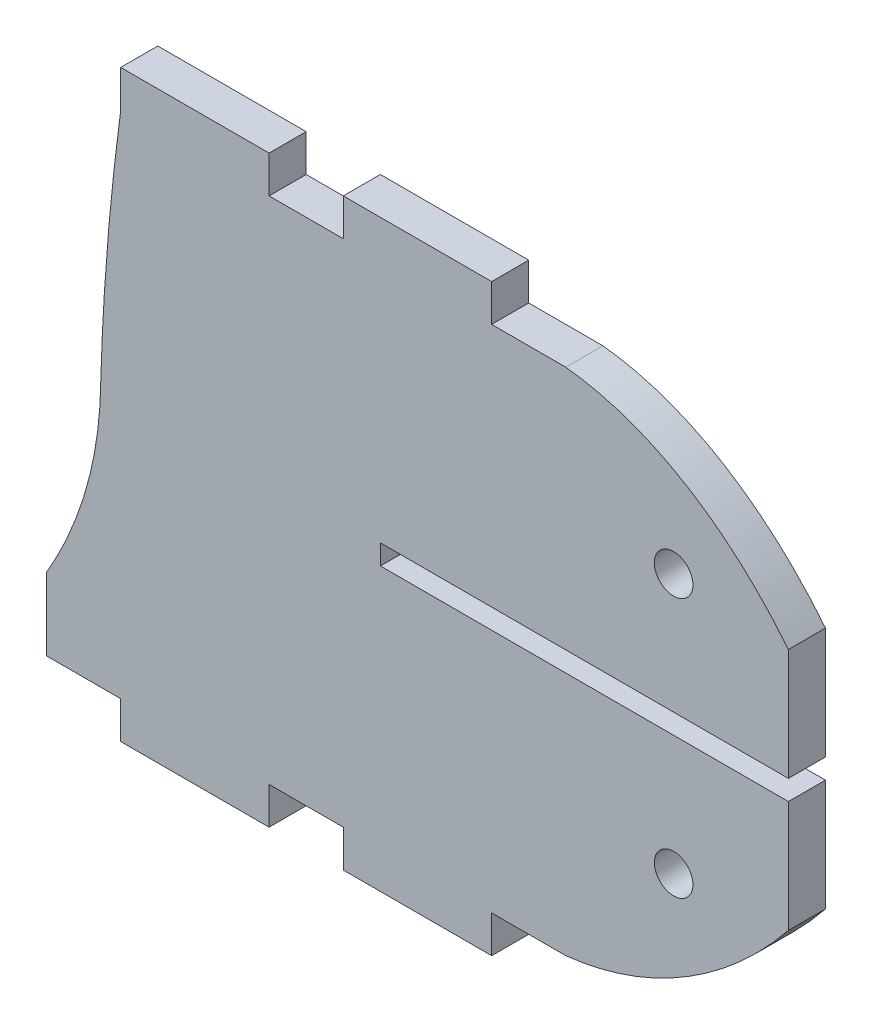
ISO-10303-21;
HEADER;
FILE_DESCRIPTION(('STEP AP214'),'2;1');
FILE_NAME('part.step','',(''),(''),'','','');
FILE_SCHEMA(('AUTOMOTIVE_DESIGN { 1 0 10303 214 1 1 1 1 }'));
ENDSEC;
DATA;
#1=APPLICATION_CONTEXT('core data for automotive mechanical design processes');
#2=APPLICATION_PROTOCOL_DEFINITION('international standard','automotive_design',2000,#1);
#3=PRODUCT_CONTEXT('',#1,'mechanical');
#4=PRODUCT('Part','Part','',(#3));
#5=PRODUCT_RELATED_PRODUCT_CATEGORY('part','',(#4));
#6=PRODUCT_DEFINITION_FORMATION('','',#4);
#7=PRODUCT_DEFINITION_CONTEXT('part definition',#1,'design');
#8=PRODUCT_DEFINITION('design','',#6,#7);
#9=PRODUCT_DEFINITION_SHAPE('','',#8);
#10=(LENGTH_UNIT() NAMED_UNIT(*) SI_UNIT(.MILLI.,.METRE.));
#11=(NAMED_UNIT(*) PLANE_ANGLE_UNIT() SI_UNIT($,.RADIAN.));
#12=(NAMED_UNIT(*) SI_UNIT($,.STERADIAN.) SOLID_ANGLE_UNIT());
#13=UNCERTAINTY_MEASURE_WITH_UNIT(LENGTH_MEASURE(1.E-05),#10,'distance_accuracy_value','');
#14=(GEOMETRIC_REPRESENTATION_CONTEXT(3) GLOBAL_UNCERTAINTY_ASSIGNED_CONTEXT((#13)) GLOBAL_UNIT_ASSIGNED_CONTEXT((#10,
#11,#12)) REPRESENTATION_CONTEXT('',''));
#15=CARTESIAN_POINT('',(0.,0.,0.));
#16=DIRECTION('',(0.,0.,1.));
#17=DIRECTION('',(1.,0.,0.));
#18=AXIS2_PLACEMENT_3D('',#15,#16,#17);
#19=CARTESIAN_POINT('',(-179.39503941317,-95.65,5.));
#20=CARTESIAN_POINT('',(-181.601038643101,-112.074647686193,5.));
#21=CARTESIAN_POINT('',(-182.084492751926,-128.65,5.));
#22=B_SPLINE_CURVE_WITH_KNOTS('',2,(#19,#20,#21),.UNSPECIFIED.,.F.,.F.,(3,3),(0.,1.),.UNSPECIFIED.);
#23=DIRECTION('',(0.,0.,-1.));
#24=VECTOR('',#23,1.);
#25=SURFACE_OF_LINEAR_EXTRUSION('',#22,#24);
#26=CARTESIAN_POINT('',(-179.39503941317,-95.65,0.));
#27=CARTESIAN_POINT('',(-181.601038643101,-112.074647686193,0.));
#28=CARTESIAN_POINT('',(-182.084492751926,-128.65,0.));
#29=B_SPLINE_CURVE_WITH_KNOTS('',2,(#26,#27,#28),.UNSPECIFIED.,.F.,.F.,(3,3),(0.,1.),.UNSPECIFIED.);
#30=CARTESIAN_POINT('',(-179.39503941317,-95.65,0.));
#31=VERTEX_POINT('',#30);
#32=CARTESIAN_POINT('',(-182.084492751926,-128.65,0.));
#33=VERTEX_POINT('',#32);
#34=EDGE_CURVE('E271',#31,#33,#29,.T.);
#35=ORIENTED_EDGE('',*,*,#34,.T.);
#36=DIRECTION('',(0.,0.,-1.));
#37=VECTOR('',#36,1.);
#38=CARTESIAN_POINT('',(-182.084492751926,-128.65,5.));
#39=LINE('',#38,#37);
#40=CARTESIAN_POINT('',(-182.084492751926,-128.65,5.));
#41=VERTEX_POINT('',#40);
#42=EDGE_CURVE('E11',#41,#33,#39,.T.);
#43=ORIENTED_EDGE('',*,*,#42,.F.);
#44=CARTESIAN_POINT('',(-179.39503941317,-95.65,5.));
#45=VERTEX_POINT('',#44);
#46=EDGE_CURVE('E489',#45,#41,#22,.T.);
#47=ORIENTED_EDGE('',*,*,#46,.F.);
#48=DIRECTION('',(0.,0.,-1.));
#49=VECTOR('',#48,1.);
#50=CARTESIAN_POINT('',(-179.39503941317,-95.65,5.));
#51=LINE('',#50,#49);
#52=EDGE_CURVE('E63',#45,#31,#51,.T.);
#53=ORIENTED_EDGE('',*,*,#52,.T.);
#54=EDGE_LOOP('',(#35,#43,#47,#53));
#55=FACE_BOUND('',#54,.T.);
#56=ADVANCED_FACE('F45',(#55),#25,.F.);
#57=CARTESIAN_POINT('',(-182.084492751926,-128.65,5.));
#58=CARTESIAN_POINT('',(-182.242729915213,-142.322113050218,5.));
#59=CARTESIAN_POINT('',(-189.39503941317,-154.585895155191,5.));
#60=B_SPLINE_CURVE_WITH_KNOTS('',2,(#57,#58,#59),.UNSPECIFIED.,.F.,.F.,(3,3),(0.,1.),.UNSPECIFIED.);
#61=DIRECTION('',(0.,0.,-1.));
#62=VECTOR('',#61,1.);
#63=SURFACE_OF_LINEAR_EXTRUSION('',#60,#62);
#64=CARTESIAN_POINT('',(-182.084492751926,-128.65,0.));
#65=CARTESIAN_POINT('',(-182.242729915213,-142.322113050218,0.));
#66=CARTESIAN_POINT('',(-189.39503941317,-154.585895155191,0.));
#67=B_SPLINE_CURVE_WITH_KNOTS('',2,(#64,#65,#66),.UNSPECIFIED.,.F.,.F.,(3,3),(0.,1.),.UNSPECIFIED.);
#68=CARTESIAN_POINT('',(-189.39503941317,-154.585895155191,0.));
#69=VERTEX_POINT('',#68);
#70=EDGE_CURVE('E276',#33,#69,#67,.T.);
#71=ORIENTED_EDGE('',*,*,#70,.T.);
#72=DIRECTION('',(0.,0.,-1.));
#73=VECTOR('',#72,1.);
#74=CARTESIAN_POINT('',(-189.39503941317,-154.585895155191,5.));
#75=LINE('',#74,#73);
#76=CARTESIAN_POINT('',(-189.39503941317,-154.585895155191,5.));
#77=VERTEX_POINT('',#76);
#78=EDGE_CURVE('E55',#77,#69,#75,.T.);
#79=ORIENTED_EDGE('',*,*,#78,.F.);
#80=EDGE_CURVE('E158',#41,#77,#60,.T.);
#81=ORIENTED_EDGE('',*,*,#80,.F.);
#82=ORIENTED_EDGE('',*,*,#42,.T.);
#83=EDGE_LOOP('',(#71,#79,#81,#82));
#84=FACE_BOUND('',#83,.T.);
#85=ADVANCED_FACE('F470',(#84),#63,.F.);
#86=CARTESIAN_POINT('',(-189.39503941317,0.,5.));
#87=DIRECTION('',(-1.,0.,0.));
#88=DIRECTION('',(0.,0.,1.));
#89=AXIS2_PLACEMENT_3D('',#86,#87,#88);
#90=PLANE('',#89);
#91=DIRECTION('',(0.,1.,0.));
#92=VECTOR('',#91,1.);
#93=CARTESIAN_POINT('',(-189.39503941317,0.,0.));
#94=LINE('',#93,#92);
#95=CARTESIAN_POINT('',(-189.39503941317,-164.35,0.));
#96=VERTEX_POINT('',#95);
#97=EDGE_CURVE('E285',#96,#69,#94,.T.);
#98=ORIENTED_EDGE('',*,*,#97,.F.);
#99=DIRECTION('',(0.,0.,-1.));
#100=VECTOR('',#99,1.);
#101=CARTESIAN_POINT('',(-189.39503941317,-164.35,5.));
#102=LINE('',#101,#100);
#103=CARTESIAN_POINT('',(-189.39503941317,-164.35,5.));
#104=VERTEX_POINT('',#103);
#105=EDGE_CURVE('E461',#104,#96,#102,.T.);
#106=ORIENTED_EDGE('',*,*,#105,.F.);
#107=DIRECTION('',(0.,1.,0.));
#108=VECTOR('',#107,1.);
#109=CARTESIAN_POINT('',(-189.39503941317,0.,5.));
#110=LINE('',#109,#108);
#111=EDGE_CURVE('E469',#104,#77,#110,.T.);
#112=ORIENTED_EDGE('',*,*,#111,.T.);
#113=ORIENTED_EDGE('',*,*,#78,.T.);
#114=EDGE_LOOP('',(#98,#106,#112,#113));
#115=FACE_BOUND('',#114,.T.);
#116=ADVANCED_FACE('F467',(#115),#90,.T.);
#117=CARTESIAN_POINT('',(0.,-164.35,5.));
#118=DIRECTION('',(0.,-1.,0.));
#119=DIRECTION('',(0.,0.,-1.));
#120=AXIS2_PLACEMENT_3D('',#117,#118,#119);
#121=PLANE('',#120);
#122=DIRECTION('',(-1.,0.,0.));
#123=VECTOR('',#122,1.);
#124=CARTESIAN_POINT('',(0.,-164.35,0.));
#125=LINE('',#124,#123);
#126=CARTESIAN_POINT('',(-179.39503941317,-164.35,0.));
#127=VERTEX_POINT('',#126);
#128=EDGE_CURVE('E292',#127,#96,#125,.T.);
#129=ORIENTED_EDGE('',*,*,#128,.F.);
#130=DIRECTION('',(0.,0.,-1.));
#131=VECTOR('',#130,1.);
#132=CARTESIAN_POINT('',(-179.39503941317,-164.35,5.));
#133=LINE('',#132,#131);
#134=CARTESIAN_POINT('',(-179.39503941317,-164.35,5.));
#135=VERTEX_POINT('',#134);
#136=EDGE_CURVE('E458',#135,#127,#133,.T.);
#137=ORIENTED_EDGE('',*,*,#136,.F.);
#138=DIRECTION('',(-1.,0.,0.));
#139=VECTOR('',#138,1.);
#140=CARTESIAN_POINT('',(0.,-164.35,5.));
#141=LINE('',#140,#139);
#142=EDGE_CURVE('E482',#135,#104,#141,.T.);
#143=ORIENTED_EDGE('',*,*,#142,.T.);
#144=ORIENTED_EDGE('',*,*,#105,.T.);
#145=EDGE_LOOP('',(#129,#137,#143,#144));
#146=FACE_BOUND('',#145,.T.);
#147=ADVANCED_FACE('F478',(#146),#121,.T.);
#148=CARTESIAN_POINT('',(-179.39503941317,0.,5.));
#149=DIRECTION('',(1.,0.,0.));
#150=DIRECTION('',(0.,0.,-1.));
#151=AXIS2_PLACEMENT_3D('',#148,#149,#150);
#152=PLANE('',#151);
#153=DIRECTION('',(0.,-1.,0.));
#154=VECTOR('',#153,1.);
#155=CARTESIAN_POINT('',(-179.39503941317,0.,0.));
#156=LINE('',#155,#154);
#157=CARTESIAN_POINT('',(-179.39503941317,-169.35,0.));
#158=VERTEX_POINT('',#157);
#159=EDGE_CURVE('E296',#127,#158,#156,.T.);
#160=ORIENTED_EDGE('',*,*,#159,.T.);
#161=DIRECTION('',(0.,0.,-1.));
#162=VECTOR('',#161,1.);
#163=CARTESIAN_POINT('',(-179.39503941317,-169.35,5.));
#164=LINE('',#163,#162);
#165=CARTESIAN_POINT('',(-179.39503941317,-169.35,5.));
#166=VERTEX_POINT('',#165);
#167=EDGE_CURVE('E454',#166,#158,#164,.T.);
#168=ORIENTED_EDGE('',*,*,#167,.F.);
#169=DIRECTION('',(0.,-1.,0.));
#170=VECTOR('',#169,1.);
#171=CARTESIAN_POINT('',(-179.39503941317,0.,5.));
#172=LINE('',#171,#170);
#173=EDGE_CURVE('E487',#135,#166,#172,.T.);
#174=ORIENTED_EDGE('',*,*,#173,.F.);
#175=ORIENTED_EDGE('',*,*,#136,.T.);
#176=EDGE_LOOP('',(#160,#168,#174,#175));
#177=FACE_BOUND('',#176,.T.);
#178=ADVANCED_FACE('F570',(#177),#152,.F.);
#179=CARTESIAN_POINT('',(0.,-169.35,5.));
#180=DIRECTION('',(0.,1.,0.));
#181=DIRECTION('',(0.,0.,1.));
#182=AXIS2_PLACEMENT_3D('',#179,#180,#181);
#183=PLANE('',#182);
#184=DIRECTION('',(1.,0.,0.));
#185=VECTOR('',#184,1.);
#186=CARTESIAN_POINT('',(0.,-169.35,0.));
#187=LINE('',#186,#185);
#188=CARTESIAN_POINT('',(-159.39503941317,-169.35,0.));
#189=VERTEX_POINT('',#188);
#190=EDGE_CURVE('E299',#158,#189,#187,.T.);
#191=ORIENTED_EDGE('',*,*,#190,.T.);
#192=DIRECTION('',(0.,0.,-1.));
#193=VECTOR('',#192,1.);
#194=CARTESIAN_POINT('',(-159.39503941317,-169.35,5.));
#195=LINE('',#194,#193);
#196=CARTESIAN_POINT('',(-159.39503941317,-169.35,5.));
#197=VERTEX_POINT('',#196);
#198=EDGE_CURVE('E451',#197,#189,#195,.T.);
#199=ORIENTED_EDGE('',*,*,#198,.F.);
#200=DIRECTION('',(1.,0.,0.));
#201=VECTOR('',#200,1.);
#202=CARTESIAN_POINT('',(0.,-169.35,5.));
#203=LINE('',#202,#201);
#204=EDGE_CURVE('E498',#166,#197,#203,.T.);
#205=ORIENTED_EDGE('',*,*,#204,.F.);
#206=ORIENTED_EDGE('',*,*,#167,.T.);
#207=EDGE_LOOP('',(#191,#199,#205,#206));
#208=FACE_BOUND('',#207,.T.);
#209=ADVANCED_FACE('F566',(#208),#183,.F.);
#210=CARTESIAN_POINT('',(-159.39503941317,0.,5.));
#211=DIRECTION('',(1.,0.,0.));
#212=DIRECTION('',(0.,0.,-1.));
#213=AXIS2_PLACEMENT_3D('',#210,#211,#212);
#214=PLANE('',#213);
#215=DIRECTION('',(0.,-1.,0.));
#216=VECTOR('',#215,1.);
#217=CARTESIAN_POINT('',(-159.39503941317,0.,0.));
#218=LINE('',#217,#216);
#219=CARTESIAN_POINT('',(-159.39503941317,-164.35,0.));
#220=VERTEX_POINT('',#219);
#221=EDGE_CURVE('E303',#220,#189,#218,.T.);
#222=ORIENTED_EDGE('',*,*,#221,.F.);
#223=DIRECTION('',(0.,0.,-1.));
#224=VECTOR('',#223,1.);
#225=CARTESIAN_POINT('',(-159.39503941317,-164.35,5.));
#226=LINE('',#225,#224);
#227=CARTESIAN_POINT('',(-159.39503941317,-164.35,5.));
#228=VERTEX_POINT('',#227);
#229=EDGE_CURVE('E448',#228,#220,#226,.T.);
#230=ORIENTED_EDGE('',*,*,#229,.F.);
#231=DIRECTION('',(0.,-1.,0.));
#232=VECTOR('',#231,1.);
#233=CARTESIAN_POINT('',(-159.39503941317,0.,5.));
#234=LINE('',#233,#232);
#235=EDGE_CURVE('E501',#228,#197,#234,.T.);
#236=ORIENTED_EDGE('',*,*,#235,.T.);
#237=ORIENTED_EDGE('',*,*,#198,.T.);
#238=EDGE_LOOP('',(#222,#230,#236,#237));
#239=FACE_BOUND('',#238,.T.);
#240=ADVANCED_FACE('F562',(#239),#214,.T.);
#241=CARTESIAN_POINT('',(0.,-164.35,5.));
#242=DIRECTION('',(0.,-1.,0.));
#243=DIRECTION('',(0.,0.,-1.));
#244=AXIS2_PLACEMENT_3D('',#241,#242,#243);
#245=PLANE('',#244);
#246=DIRECTION('',(-1.,0.,0.));
#247=VECTOR('',#246,1.);
#248=CARTESIAN_POINT('',(0.,-164.35,0.));
#249=LINE('',#248,#247);
#250=CARTESIAN_POINT('',(-149.39503941317,-164.35,0.));
#251=VERTEX_POINT('',#250);
#252=EDGE_CURVE('E307',#251,#220,#249,.T.);
#253=ORIENTED_EDGE('',*,*,#252,.F.);
#254=DIRECTION('',(0.,0.,-1.));
#255=VECTOR('',#254,1.);
#256=CARTESIAN_POINT('',(-149.39503941317,-164.35,5.));
#257=LINE('',#256,#255);
#258=CARTESIAN_POINT('',(-149.39503941317,-164.35,5.));
#259=VERTEX_POINT('',#258);
#260=EDGE_CURVE('E445',#259,#251,#257,.T.);
#261=ORIENTED_EDGE('',*,*,#260,.F.);
#262=DIRECTION('',(-1.,0.,0.));
#263=VECTOR('',#262,1.);
#264=CARTESIAN_POINT('',(0.,-164.35,5.));
#265=LINE('',#264,#263);
#266=EDGE_CURVE('E505',#259,#228,#265,.T.);
#267=ORIENTED_EDGE('',*,*,#266,.T.);
#268=ORIENTED_EDGE('',*,*,#229,.T.);
#269=EDGE_LOOP('',(#253,#261,#267,#268));
#270=FACE_BOUND('',#269,.T.);
#271=ADVANCED_FACE('F558',(#270),#245,.T.);
#272=CARTESIAN_POINT('',(-149.39503941317,0.,5.));
#273=DIRECTION('',(1.,0.,0.));
#274=DIRECTION('',(0.,0.,-1.));
#275=AXIS2_PLACEMENT_3D('',#272,#273,#274);
#276=PLANE('',#275);
#277=DIRECTION('',(0.,-1.,0.));
#278=VECTOR('',#277,1.);
#279=CARTESIAN_POINT('',(-149.39503941317,0.,0.));
#280=LINE('',#279,#278);
#281=CARTESIAN_POINT('',(-149.39503941317,-169.35,0.));
#282=VERTEX_POINT('',#281);
#283=EDGE_CURVE('E311',#251,#282,#280,.T.);
#284=ORIENTED_EDGE('',*,*,#283,.T.);
#285=DIRECTION('',(0.,0.,-1.));
#286=VECTOR('',#285,1.);
#287=CARTESIAN_POINT('',(-149.39503941317,-169.35,5.));
#288=LINE('',#287,#286);
#289=CARTESIAN_POINT('',(-149.39503941317,-169.35,5.));
#290=VERTEX_POINT('',#289);
#291=EDGE_CURVE('E441',#290,#282,#288,.T.);
#292=ORIENTED_EDGE('',*,*,#291,.F.);
#293=DIRECTION('',(0.,-1.,0.));
#294=VECTOR('',#293,1.);
#295=CARTESIAN_POINT('',(-149.39503941317,0.,5.));
#296=LINE('',#295,#294);
#297=EDGE_CURVE('E509',#259,#290,#296,.T.);
#298=ORIENTED_EDGE('',*,*,#297,.F.);
#299=ORIENTED_EDGE('',*,*,#260,.T.);
#300=EDGE_LOOP('',(#284,#292,#298,#299));
#301=FACE_BOUND('',#300,.T.);
#302=ADVANCED_FACE('F554',(#301),#276,.F.);
#303=CARTESIAN_POINT('',(0.,-169.35,5.));
#304=DIRECTION('',(0.,1.,0.));
#305=DIRECTION('',(0.,0.,1.));
#306=AXIS2_PLACEMENT_3D('',#303,#304,#305);
#307=PLANE('',#306);
#308=DIRECTION('',(1.,0.,0.));
#309=VECTOR('',#308,1.);
#310=CARTESIAN_POINT('',(0.,-169.35,0.));
#311=LINE('',#310,#309);
#312=CARTESIAN_POINT('',(-129.39503941317,-169.35,0.));
#313=VERTEX_POINT('',#312);
#314=EDGE_CURVE('E314',#282,#313,#311,.T.);
#315=ORIENTED_EDGE('',*,*,#314,.T.);
#316=DIRECTION('',(0.,0.,-1.));
#317=VECTOR('',#316,1.);
#318=CARTESIAN_POINT('',(-129.39503941317,-169.35,5.));
#319=LINE('',#318,#317);
#320=CARTESIAN_POINT('',(-129.39503941317,-169.35,5.));
#321=VERTEX_POINT('',#320);
#322=EDGE_CURVE('E438',#321,#313,#319,.T.);
#323=ORIENTED_EDGE('',*,*,#322,.F.);
#324=DIRECTION('',(1.,0.,0.));
#325=VECTOR('',#324,1.);
#326=CARTESIAN_POINT('',(0.,-169.35,5.));
#327=LINE('',#326,#325);
#328=EDGE_CURVE('E512',#290,#321,#327,.T.);
#329=ORIENTED_EDGE('',*,*,#328,.F.);
#330=ORIENTED_EDGE('',*,*,#291,.T.);
#331=EDGE_LOOP('',(#315,#323,#329,#330));
#332=FACE_BOUND('',#331,.T.);
#333=ADVANCED_FACE('F550',(#332),#307,.F.);
#334=CARTESIAN_POINT('',(-129.39503941317,0.,5.));
#335=DIRECTION('',(1.,0.,0.));
#336=DIRECTION('',(0.,0.,-1.));
#337=AXIS2_PLACEMENT_3D('',#334,#335,#336);
#338=PLANE('',#337);
#339=DIRECTION('',(0.,-1.,0.));
#340=VECTOR('',#339,1.);
#341=CARTESIAN_POINT('',(-129.39503941317,0.,0.));
#342=LINE('',#341,#340);
#343=CARTESIAN_POINT('',(-129.39503941317,-164.35,0.));
#344=VERTEX_POINT('',#343);
#345=EDGE_CURVE('E318',#344,#313,#342,.T.);
#346=ORIENTED_EDGE('',*,*,#345,.F.);
#347=DIRECTION('',(0.,0.,-1.));
#348=VECTOR('',#347,1.);
#349=CARTESIAN_POINT('',(-129.39503941317,-164.35,5.));
#350=LINE('',#349,#348);
#351=CARTESIAN_POINT('',(-129.39503941317,-164.35,5.));
#352=VERTEX_POINT('',#351);
#353=EDGE_CURVE('E435',#352,#344,#350,.T.);
#354=ORIENTED_EDGE('',*,*,#353,.F.);
#355=DIRECTION('',(0.,-1.,0.));
#356=VECTOR('',#355,1.);
#357=CARTESIAN_POINT('',(-129.39503941317,0.,5.));
#358=LINE('',#357,#356);
#359=EDGE_CURVE('E515',#352,#321,#358,.T.);
#360=ORIENTED_EDGE('',*,*,#359,.T.);
#361=ORIENTED_EDGE('',*,*,#322,.T.);
#362=EDGE_LOOP('',(#346,#354,#360,#361));
#363=FACE_BOUND('',#362,.T.);
#364=ADVANCED_FACE('F546',(#363),#338,.T.);
#365=CARTESIAN_POINT('',(-4.56162885242862E-13,-164.35,5.));
#366=DIRECTION('',(0.,-1.,0.));
#367=DIRECTION('',(1.,0.,0.));
#368=AXIS2_PLACEMENT_3D('',#365,#366,#367);
#369=PLANE('',#368);
#370=DIRECTION('',(-1.,0.,0.));
#371=VECTOR('',#370,1.);
#372=CARTESIAN_POINT('',(-4.56162885242862E-13,-164.35,0.));
#373=LINE('',#372,#371);
#374=CARTESIAN_POINT('',(-119.39503941317,-164.35,0.));
#375=VERTEX_POINT('',#374);
#376=EDGE_CURVE('E322',#375,#344,#373,.T.);
#377=ORIENTED_EDGE('',*,*,#376,.F.);
#378=DIRECTION('',(0.,0.,-1.));
#379=VECTOR('',#378,1.);
#380=CARTESIAN_POINT('',(-119.39503941317,-164.35,5.));
#381=LINE('',#380,#379);
#382=CARTESIAN_POINT('',(-119.39503941317,-164.35,5.));
#383=VERTEX_POINT('',#382);
#384=EDGE_CURVE('E432',#383,#375,#381,.T.);
#385=ORIENTED_EDGE('',*,*,#384,.F.);
#386=DIRECTION('',(-1.,0.,0.));
#387=VECTOR('',#386,1.);
#388=CARTESIAN_POINT('',(-4.56162885242862E-13,-164.35,5.));
#389=LINE('',#388,#387);
#390=EDGE_CURVE('E519',#383,#352,#389,.T.);
#391=ORIENTED_EDGE('',*,*,#390,.T.);
#392=ORIENTED_EDGE('',*,*,#353,.T.);
#393=EDGE_LOOP('',(#377,#385,#391,#392));
#394=FACE_BOUND('',#393,.T.);
#395=ADVANCED_FACE('F541',(#394),#369,.T.);
#396=CARTESIAN_POINT('',(-89.3950394131705,-146.397267383453,5.));
#397=CARTESIAN_POINT('',(-96.8317526038258,-155.655105269545,5.));
#398=CARTESIAN_POINT('',(-107.166514085355,-163.002537558344,5.));
#399=CARTESIAN_POINT('',(-119.39503941317,-164.35,5.));
#400=B_SPLINE_CURVE_WITH_KNOTS('',3,(#396,#397,#398,#399),.UNSPECIFIED.,.F.,.F.,(4,4),(0.,1.),.UNSPECIFIED.);
#401=DIRECTION('',(0.,0.,-1.));
#402=VECTOR('',#401,1.);
#403=SURFACE_OF_LINEAR_EXTRUSION('',#400,#402);
#404=CARTESIAN_POINT('',(-89.3950394131705,-146.397267383453,0.));
#405=CARTESIAN_POINT('',(-96.8317526038258,-155.655105269545,0.));
#406=CARTESIAN_POINT('',(-107.166514085355,-163.002537558344,0.));
#407=CARTESIAN_POINT('',(-119.39503941317,-164.35,0.));
#408=B_SPLINE_CURVE_WITH_KNOTS('',3,(#404,#405,#406,#407),.UNSPECIFIED.,.F.,.F.,(4,4),(0.,1.),.UNSPECIFIED.);
#409=CARTESIAN_POINT('',(-89.3950394131705,-146.397267383453,0.));
#410=VERTEX_POINT('',#409);
#411=EDGE_CURVE('E326',#410,#375,#408,.T.);
#412=ORIENTED_EDGE('',*,*,#411,.F.);
#413=DIRECTION('',(0.,0.,-1.));
#414=VECTOR('',#413,1.);
#415=CARTESIAN_POINT('',(-89.3950394131705,-146.397267383453,5.));
#416=LINE('',#415,#414);
#417=CARTESIAN_POINT('',(-89.3950394131705,-146.397267383453,5.));
#418=VERTEX_POINT('',#417);
#419=EDGE_CURVE('E429',#418,#410,#416,.T.);
#420=ORIENTED_EDGE('',*,*,#419,.F.);
#421=EDGE_CURVE('E523',#418,#383,#400,.T.);
#422=ORIENTED_EDGE('',*,*,#421,.T.);
#423=ORIENTED_EDGE('',*,*,#384,.T.);
#424=EDGE_LOOP('',(#412,#420,#422,#423));
#425=FACE_BOUND('',#424,.T.);
#426=ADVANCED_FACE('F536',(#425),#403,.T.);
#427=CARTESIAN_POINT('',(-89.3950394131705,0.,5.));
#428=DIRECTION('',(-1.,0.,0.));
#429=DIRECTION('',(0.,0.,1.));
#430=AXIS2_PLACEMENT_3D('',#427,#428,#429);
#431=PLANE('',#430);
#432=DIRECTION('',(0.,1.,0.));
#433=VECTOR('',#432,1.);
#434=CARTESIAN_POINT('',(-89.3950394131705,0.,0.));
#435=LINE('',#434,#433);
#436=CARTESIAN_POINT('',(-89.3950394131705,-131.35,0.));
#437=VERTEX_POINT('',#436);
#438=EDGE_CURVE('E332',#410,#437,#435,.T.);
#439=ORIENTED_EDGE('',*,*,#438,.T.);
#440=DIRECTION('',(0.,0.,-1.));
#441=VECTOR('',#440,1.);
#442=CARTESIAN_POINT('',(-89.3950394131705,-131.35,5.));
#443=LINE('',#442,#441);
#444=CARTESIAN_POINT('',(-89.3950394131705,-131.35,5.));
#445=VERTEX_POINT('',#444);
#446=EDGE_CURVE('E426',#445,#437,#443,.T.);
#447=ORIENTED_EDGE('',*,*,#446,.F.);
#448=DIRECTION('',(0.,1.,0.));
#449=VECTOR('',#448,1.);
#450=CARTESIAN_POINT('',(-89.3950394131705,0.,5.));
#451=LINE('',#450,#449);
#452=EDGE_CURVE('E530',#418,#445,#451,.T.);
#453=ORIENTED_EDGE('',*,*,#452,.F.);
#454=ORIENTED_EDGE('',*,*,#419,.T.);
#455=EDGE_LOOP('',(#439,#447,#453,#454));
#456=FACE_BOUND('',#455,.T.);
#457=ADVANCED_FACE('F540',(#456),#431,.F.);
#458=CARTESIAN_POINT('',(0.,-131.35,5.));
#459=DIRECTION('',(0.,1.,0.));
#460=DIRECTION('',(-1.,0.,0.));
#461=AXIS2_PLACEMENT_3D('',#458,#459,#460);
#462=PLANE('',#461);
#463=DIRECTION('',(1.,0.,0.));
#464=VECTOR('',#463,1.);
#465=CARTESIAN_POINT('',(0.,-131.35,0.));
#466=LINE('',#465,#464);
#467=CARTESIAN_POINT('',(-144.39503941317,-131.35,0.));
#468=VERTEX_POINT('',#467);
#469=EDGE_CURVE('E339',#468,#437,#466,.T.);
#470=ORIENTED_EDGE('',*,*,#469,.F.);
#471=DIRECTION('',(0.,0.,-1.));
#472=VECTOR('',#471,1.);
#473=CARTESIAN_POINT('',(-144.39503941317,-131.35,5.));
#474=LINE('',#473,#472);
#475=CARTESIAN_POINT('',(-144.39503941317,-131.35,5.));
#476=VERTEX_POINT('',#475);
#477=EDGE_CURVE('E423',#476,#468,#474,.T.);
#478=ORIENTED_EDGE('',*,*,#477,.F.);
#479=DIRECTION('',(1.,0.,0.));
#480=VECTOR('',#479,1.);
#481=CARTESIAN_POINT('',(0.,-131.35,5.));
#482=LINE('',#481,#480);
#483=EDGE_CURVE('E686',#476,#445,#482,.T.);
#484=ORIENTED_EDGE('',*,*,#483,.T.);
#485=ORIENTED_EDGE('',*,*,#446,.T.);
#486=EDGE_LOOP('',(#470,#478,#484,#485));
#487=FACE_BOUND('',#486,.T.);
#488=ADVANCED_FACE('F699',(#487),#462,.T.);
#489=CARTESIAN_POINT('',(-144.395039413172,-1.48435830924222E-12,5.));
#490=DIRECTION('',(-1.,0.,0.));
#491=DIRECTION('',(0.,-1.,0.));
#492=AXIS2_PLACEMENT_3D('',#489,#490,#491);
#493=PLANE('',#492);
#494=DIRECTION('',(0.,1.,0.));
#495=VECTOR('',#494,1.);
#496=CARTESIAN_POINT('',(-144.395039413172,-1.48435830924222E-12,0.));
#497=LINE('',#496,#495);
#498=CARTESIAN_POINT('',(-144.395039413171,-128.65,0.));
#499=VERTEX_POINT('',#498);
#500=EDGE_CURVE('E343',#468,#499,#497,.T.);
#501=ORIENTED_EDGE('',*,*,#500,.T.);
#502=DIRECTION('',(0.,0.,-1.));
#503=VECTOR('',#502,1.);
#504=CARTESIAN_POINT('',(-144.395039413171,-128.65,5.));
#505=LINE('',#504,#503);
#506=CARTESIAN_POINT('',(-144.395039413171,-128.65,5.));
#507=VERTEX_POINT('',#506);
#508=EDGE_CURVE('E419',#507,#499,#505,.T.);
#509=ORIENTED_EDGE('',*,*,#508,.F.);
#510=DIRECTION('',(0.,1.,0.));
#511=VECTOR('',#510,1.);
#512=CARTESIAN_POINT('',(-144.395039413172,-1.48435830924222E-12,5.));
#513=LINE('',#512,#511);
#514=EDGE_CURVE('E684',#476,#507,#513,.T.);
#515=ORIENTED_EDGE('',*,*,#514,.F.);
#516=ORIENTED_EDGE('',*,*,#477,.T.);
#517=EDGE_LOOP('',(#501,#509,#515,#516));
#518=FACE_BOUND('',#517,.T.);
#519=ADVANCED_FACE('F704',(#518),#493,.F.);
#520=CARTESIAN_POINT('',(0.,-128.65,5.));
#521=DIRECTION('',(0.,1.,0.));
#522=DIRECTION('',(-1.,0.,0.));
#523=AXIS2_PLACEMENT_3D('',#520,#521,#522);
#524=PLANE('',#523);
#525=DIRECTION('',(1.,0.,0.));
#526=VECTOR('',#525,1.);
#527=CARTESIAN_POINT('',(0.,-128.65,0.));
#528=LINE('',#527,#526);
#529=CARTESIAN_POINT('',(-89.3950394131734,-128.65,0.));
#530=VERTEX_POINT('',#529);
#531=EDGE_CURVE('E346',#499,#530,#528,.T.);
#532=ORIENTED_EDGE('',*,*,#531,.T.);
#533=DIRECTION('',(0.,0.,-1.));
#534=VECTOR('',#533,1.);
#535=CARTESIAN_POINT('',(-89.3950394131734,-128.65,5.));
#536=LINE('',#535,#534);
#537=CARTESIAN_POINT('',(-89.3950394131734,-128.65,5.));
#538=VERTEX_POINT('',#537);
#539=EDGE_CURVE('E415',#538,#530,#536,.T.);
#540=ORIENTED_EDGE('',*,*,#539,.F.);
#541=DIRECTION('',(1.,0.,0.));
#542=VECTOR('',#541,1.);
#543=CARTESIAN_POINT('',(0.,-128.65,5.));
#544=LINE('',#543,#542);
#545=EDGE_CURVE('E682',#507,#538,#544,.T.);
#546=ORIENTED_EDGE('',*,*,#545,.F.);
#547=ORIENTED_EDGE('',*,*,#508,.T.);
#548=EDGE_LOOP('',(#532,#540,#546,#547));
#549=FACE_BOUND('',#548,.T.);
#550=ADVANCED_FACE('F710',(#549),#524,.F.);
#551=CARTESIAN_POINT('',(-89.3950394131482,1.75612581952639E-11,5.));
#552=DIRECTION('',(-1.,1.96445555710343E-13,0.));
#553=DIRECTION('',(-1.96445555710343E-13,-1.,0.));
#554=AXIS2_PLACEMENT_3D('',#551,#552,#553);
#555=PLANE('',#554);
#556=DIRECTION('',(1.96445555710343E-13,1.,0.));
#557=VECTOR('',#556,1.);
#558=CARTESIAN_POINT('',(-89.3950394131482,1.75612581952639E-11,0.));
#559=LINE('',#558,#557);
#560=CARTESIAN_POINT('',(-89.3950394131705,-113.602732616547,0.));
#561=VERTEX_POINT('',#560);
#562=EDGE_CURVE('E349',#530,#561,#559,.T.);
#563=ORIENTED_EDGE('',*,*,#562,.T.);
#564=DIRECTION('',(0.,0.,-1.));
#565=VECTOR('',#564,1.);
#566=CARTESIAN_POINT('',(-89.3950394131705,-113.602732616547,5.));
#567=LINE('',#566,#565);
#568=CARTESIAN_POINT('',(-89.3950394131705,-113.602732616547,5.));
#569=VERTEX_POINT('',#568);
#570=EDGE_CURVE('E411',#569,#561,#567,.T.);
#571=ORIENTED_EDGE('',*,*,#570,.F.);
#572=DIRECTION('',(1.96445555710343E-13,1.,0.));
#573=VECTOR('',#572,1.);
#574=CARTESIAN_POINT('',(-89.3950394131482,1.75612581952639E-11,5.));
#575=LINE('',#574,#573);
#576=EDGE_CURVE('E662',#538,#569,#575,.T.);
#577=ORIENTED_EDGE('',*,*,#576,.F.);
#578=ORIENTED_EDGE('',*,*,#539,.T.);
#579=EDGE_LOOP('',(#563,#571,#577,#578));
#580=FACE_BOUND('',#579,.T.);
#581=ADVANCED_FACE('F651',(#580),#555,.F.);
#582=CARTESIAN_POINT('',(-89.3950394131705,-113.602732616547,5.));
#583=CARTESIAN_POINT('',(-96.8317526038258,-104.344894730455,5.));
#584=CARTESIAN_POINT('',(-107.166514085355,-96.9974624416559,5.));
#585=CARTESIAN_POINT('',(-119.39503941317,-95.65,5.));
#586=B_SPLINE_CURVE_WITH_KNOTS('',3,(#582,#583,#584,#585),.UNSPECIFIED.,.F.,.F.,(4,4),(0.,1.),.UNSPECIFIED.);
#587=DIRECTION('',(0.,0.,-1.));
#588=VECTOR('',#587,1.);
#589=SURFACE_OF_LINEAR_EXTRUSION('',#586,#588);
#590=CARTESIAN_POINT('',(-89.3950394131705,-113.602732616547,0.));
#591=CARTESIAN_POINT('',(-96.8317526038258,-104.344894730455,0.));
#592=CARTESIAN_POINT('',(-107.166514085355,-96.9974624416559,0.));
#593=CARTESIAN_POINT('',(-119.39503941317,-95.65,0.));
#594=B_SPLINE_CURVE_WITH_KNOTS('',3,(#590,#591,#592,#593),.UNSPECIFIED.,.F.,.F.,(4,4),(0.,1.),.UNSPECIFIED.);
#595=CARTESIAN_POINT('',(-119.39503941317,-95.65,0.));
#596=VERTEX_POINT('',#595);
#597=EDGE_CURVE('E352',#561,#596,#594,.T.);
#598=ORIENTED_EDGE('',*,*,#597,.T.);
#599=DIRECTION('',(0.,0.,-1.));
#600=VECTOR('',#599,1.);
#601=CARTESIAN_POINT('',(-119.39503941317,-95.65,5.));
#602=LINE('',#601,#600);
#603=CARTESIAN_POINT('',(-119.39503941317,-95.65,5.));
#604=VERTEX_POINT('',#603);
#605=EDGE_CURVE('E407',#604,#596,#602,.T.);
#606=ORIENTED_EDGE('',*,*,#605,.F.);
#607=EDGE_CURVE('E654',#569,#604,#586,.T.);
#608=ORIENTED_EDGE('',*,*,#607,.F.);
#609=ORIENTED_EDGE('',*,*,#570,.T.);
#610=EDGE_LOOP('',(#598,#606,#608,#609));
#611=FACE_BOUND('',#610,.T.);
#612=ADVANCED_FACE('F646',(#611),#589,.F.);
#613=CARTESIAN_POINT('',(1.32741040381745E-13,-95.6499999999999,5.));
#614=DIRECTION('',(0.,-1.,0.));
#615=DIRECTION('',(1.,0.,0.));
#616=AXIS2_PLACEMENT_3D('',#613,#614,#615);
#617=PLANE('',#616);
#618=DIRECTION('',(-1.,0.,0.));
#619=VECTOR('',#618,1.);
#620=CARTESIAN_POINT('',(1.32741040381745E-13,-95.6499999999999,0.));
#621=LINE('',#620,#619);
#622=CARTESIAN_POINT('',(-129.39503941317,-95.65,0.));
#623=VERTEX_POINT('',#622);
#624=EDGE_CURVE('E357',#596,#623,#621,.T.);
#625=ORIENTED_EDGE('',*,*,#624,.T.);
#626=DIRECTION('',(0.,0.,-1.));
#627=VECTOR('',#626,1.);
#628=CARTESIAN_POINT('',(-129.39503941317,-95.65,5.));
#629=LINE('',#628,#627);
#630=CARTESIAN_POINT('',(-129.39503941317,-95.65,5.));
#631=VERTEX_POINT('',#630);
#632=EDGE_CURVE('E403',#631,#623,#629,.T.);
#633=ORIENTED_EDGE('',*,*,#632,.F.);
#634=DIRECTION('',(-1.,0.,0.));
#635=VECTOR('',#634,1.);
#636=CARTESIAN_POINT('',(1.32741040381745E-13,-95.6499999999999,5.));
#637=LINE('',#636,#635);
#638=EDGE_CURVE('E661',#604,#631,#637,.T.);
#639=ORIENTED_EDGE('',*,*,#638,.F.);
#640=ORIENTED_EDGE('',*,*,#605,.T.);
#641=EDGE_LOOP('',(#625,#633,#639,#640));
#642=FACE_BOUND('',#641,.T.);
#643=ADVANCED_FACE('F642',(#642),#617,.F.);
#644=CARTESIAN_POINT('',(-129.39503941317,0.,5.));
#645=DIRECTION('',(-1.,0.,0.));
#646=DIRECTION('',(0.,0.,1.));
#647=AXIS2_PLACEMENT_3D('',#644,#645,#646);
#648=PLANE('',#647);
#649=DIRECTION('',(0.,1.,0.));
#650=VECTOR('',#649,1.);
#651=CARTESIAN_POINT('',(-129.39503941317,0.,0.));
#652=LINE('',#651,#650);
#653=CARTESIAN_POINT('',(-129.39503941317,-90.65,0.));
#654=VERTEX_POINT('',#653);
#655=EDGE_CURVE('E363',#623,#654,#652,.T.);
#656=ORIENTED_EDGE('',*,*,#655,.T.);
#657=DIRECTION('',(0.,0.,-1.));
#658=VECTOR('',#657,1.);
#659=CARTESIAN_POINT('',(-129.39503941317,-90.65,5.));
#660=LINE('',#659,#658);
#661=CARTESIAN_POINT('',(-129.39503941317,-90.65,5.));
#662=VERTEX_POINT('',#661);
#663=EDGE_CURVE('E400',#662,#654,#660,.T.);
#664=ORIENTED_EDGE('',*,*,#663,.F.);
#665=DIRECTION('',(0.,1.,0.));
#666=VECTOR('',#665,1.);
#667=CARTESIAN_POINT('',(-129.39503941317,0.,5.));
#668=LINE('',#667,#666);
#669=EDGE_CURVE('E669',#631,#662,#668,.T.);
#670=ORIENTED_EDGE('',*,*,#669,.F.);
#671=ORIENTED_EDGE('',*,*,#632,.T.);
#672=EDGE_LOOP('',(#656,#664,#670,#671));
#673=FACE_BOUND('',#672,.T.);
#674=ADVANCED_FACE('F638',(#673),#648,.F.);
#675=CARTESIAN_POINT('',(0.,-90.65,5.));
#676=DIRECTION('',(0.,1.,0.));
#677=DIRECTION('',(0.,0.,1.));
#678=AXIS2_PLACEMENT_3D('',#675,#676,#677);
#679=PLANE('',#678);
#680=DIRECTION('',(1.,0.,0.));
#681=VECTOR('',#680,1.);
#682=CARTESIAN_POINT('',(0.,-90.65,0.));
#683=LINE('',#682,#681);
#684=CARTESIAN_POINT('',(-149.39503941317,-90.65,0.));
#685=VERTEX_POINT('',#684);
#686=EDGE_CURVE('E367',#685,#654,#683,.T.);
#687=ORIENTED_EDGE('',*,*,#686,.F.);
#688=DIRECTION('',(0.,0.,-1.));
#689=VECTOR('',#688,1.);
#690=CARTESIAN_POINT('',(-149.39503941317,-90.65,5.));
#691=LINE('',#690,#689);
#692=CARTESIAN_POINT('',(-149.39503941317,-90.65,5.));
#693=VERTEX_POINT('',#692);
#694=EDGE_CURVE('E397',#693,#685,#691,.T.);
#695=ORIENTED_EDGE('',*,*,#694,.F.);
#696=DIRECTION('',(1.,0.,0.));
#697=VECTOR('',#696,1.);
#698=CARTESIAN_POINT('',(0.,-90.65,5.));
#699=LINE('',#698,#697);
#700=EDGE_CURVE('E672',#693,#662,#699,.T.);
#701=ORIENTED_EDGE('',*,*,#700,.T.);
#702=ORIENTED_EDGE('',*,*,#663,.T.);
#703=EDGE_LOOP('',(#687,#695,#701,#702));
#704=FACE_BOUND('',#703,.T.);
#705=ADVANCED_FACE('F634',(#704),#679,.T.);
#706=CARTESIAN_POINT('',(-149.39503941317,0.,5.));
#707=DIRECTION('',(-1.,0.,0.));
#708=DIRECTION('',(0.,0.,1.));
#709=AXIS2_PLACEMENT_3D('',#706,#707,#708);
#710=PLANE('',#709);
#711=DIRECTION('',(0.,1.,0.));
#712=VECTOR('',#711,1.);
#713=CARTESIAN_POINT('',(-149.39503941317,0.,0.));
#714=LINE('',#713,#712);
#715=CARTESIAN_POINT('',(-149.39503941317,-95.65,0.));
#716=VERTEX_POINT('',#715);
#717=EDGE_CURVE('E371',#716,#685,#714,.T.);
#718=ORIENTED_EDGE('',*,*,#717,.F.);
#719=DIRECTION('',(0.,0.,-1.));
#720=VECTOR('',#719,1.);
#721=CARTESIAN_POINT('',(-149.39503941317,-95.65,5.));
#722=LINE('',#721,#720);
#723=CARTESIAN_POINT('',(-149.39503941317,-95.65,5.));
#724=VERTEX_POINT('',#723);
#725=EDGE_CURVE('E394',#724,#716,#722,.T.);
#726=ORIENTED_EDGE('',*,*,#725,.F.);
#727=DIRECTION('',(0.,1.,0.));
#728=VECTOR('',#727,1.);
#729=CARTESIAN_POINT('',(-149.39503941317,0.,5.));
#730=LINE('',#729,#728);
#731=EDGE_CURVE('E676',#724,#693,#730,.T.);
#732=ORIENTED_EDGE('',*,*,#731,.T.);
#733=ORIENTED_EDGE('',*,*,#694,.T.);
#734=EDGE_LOOP('',(#718,#726,#732,#733));
#735=FACE_BOUND('',#734,.T.);
#736=ADVANCED_FACE('F630',(#735),#710,.T.);
#737=CARTESIAN_POINT('',(0.,-95.65,5.));
#738=DIRECTION('',(0.,-1.,0.));
#739=DIRECTION('',(0.,0.,-1.));
#740=AXIS2_PLACEMENT_3D('',#737,#738,#739);
#741=PLANE('',#740);
#742=DIRECTION('',(-1.,0.,0.));
#743=VECTOR('',#742,1.);
#744=CARTESIAN_POINT('',(0.,-95.65,0.));
#745=LINE('',#744,#743);
#746=CARTESIAN_POINT('',(-159.39503941317,-95.65,0.));
#747=VERTEX_POINT('',#746);
#748=EDGE_CURVE('E375',#716,#747,#745,.T.);
#749=ORIENTED_EDGE('',*,*,#748,.T.);
#750=DIRECTION('',(0.,0.,-1.));
#751=VECTOR('',#750,1.);
#752=CARTESIAN_POINT('',(-159.39503941317,-95.65,5.));
#753=LINE('',#752,#751);
#754=CARTESIAN_POINT('',(-159.39503941317,-95.65,5.));
#755=VERTEX_POINT('',#754);
#756=EDGE_CURVE('E253',#755,#747,#753,.T.);
#757=ORIENTED_EDGE('',*,*,#756,.F.);
#758=DIRECTION('',(-1.,0.,0.));
#759=VECTOR('',#758,1.);
#760=CARTESIAN_POINT('',(0.,-95.65,5.));
#761=LINE('',#760,#759);
#762=EDGE_CURVE('E239',#724,#755,#761,.T.);
#763=ORIENTED_EDGE('',*,*,#762,.F.);
#764=ORIENTED_EDGE('',*,*,#725,.T.);
#765=EDGE_LOOP('',(#749,#757,#763,#764));
#766=FACE_BOUND('',#765,.T.);
#767=ADVANCED_FACE('F627',(#766),#741,.F.);
#768=CARTESIAN_POINT('',(-159.39503941317,0.,5.));
#769=DIRECTION('',(-1.,0.,0.));
#770=DIRECTION('',(0.,0.,1.));
#771=AXIS2_PLACEMENT_3D('',#768,#769,#770);
#772=PLANE('',#771);
#773=DIRECTION('',(0.,1.,0.));
#774=VECTOR('',#773,1.);
#775=CARTESIAN_POINT('',(-159.39503941317,0.,0.));
#776=LINE('',#775,#774);
#777=CARTESIAN_POINT('',(-159.39503941317,-90.65,0.));
#778=VERTEX_POINT('',#777);
#779=EDGE_CURVE('E249',#747,#778,#776,.T.);
#780=ORIENTED_EDGE('',*,*,#779,.T.);
#781=DIRECTION('',(0.,0.,-1.));
#782=VECTOR('',#781,1.);
#783=CARTESIAN_POINT('',(-159.39503941317,-90.65,5.));
#784=LINE('',#783,#782);
#785=CARTESIAN_POINT('',(-159.39503941317,-90.65,5.));
#786=VERTEX_POINT('',#785);
#787=EDGE_CURVE('E246',#786,#778,#784,.T.);
#788=ORIENTED_EDGE('',*,*,#787,.F.);
#789=DIRECTION('',(0.,1.,0.));
#790=VECTOR('',#789,1.);
#791=CARTESIAN_POINT('',(-159.39503941317,0.,5.));
#792=LINE('',#791,#790);
#793=EDGE_CURVE('E231',#755,#786,#792,.T.);
#794=ORIENTED_EDGE('',*,*,#793,.F.);
#795=ORIENTED_EDGE('',*,*,#756,.T.);
#796=EDGE_LOOP('',(#780,#788,#794,#795));
#797=FACE_BOUND('',#796,.T.);
#798=ADVANCED_FACE('F247',(#797),#772,.F.);
#799=CARTESIAN_POINT('',(0.,-90.65,5.));
#800=DIRECTION('',(0.,1.,0.));
#801=DIRECTION('',(0.,0.,1.));
#802=AXIS2_PLACEMENT_3D('',#799,#800,#801);
#803=PLANE('',#802);
#804=DIRECTION('',(1.,0.,0.));
#805=VECTOR('',#804,1.);
#806=CARTESIAN_POINT('',(0.,-90.65,0.));
#807=LINE('',#806,#805);
#808=CARTESIAN_POINT('',(-179.39503941317,-90.65,0.));
#809=VERTEX_POINT('',#808);
#810=EDGE_CURVE('E380',#809,#778,#807,.T.);
#811=ORIENTED_EDGE('',*,*,#810,.F.);
#812=DIRECTION('',(0.,0.,-1.));
#813=VECTOR('',#812,1.);
#814=CARTESIAN_POINT('',(-179.39503941317,-90.65,5.));
#815=LINE('',#814,#813);
#816=CARTESIAN_POINT('',(-179.39503941317,-90.65,5.));
#817=VERTEX_POINT('',#816);
#818=EDGE_CURVE('E146',#817,#809,#815,.T.);
#819=ORIENTED_EDGE('',*,*,#818,.F.);
#820=DIRECTION('',(1.,0.,0.));
#821=VECTOR('',#820,1.);
#822=CARTESIAN_POINT('',(0.,-90.65,5.));
#823=LINE('',#822,#821);
#824=EDGE_CURVE('E236',#817,#786,#823,.T.);
#825=ORIENTED_EDGE('',*,*,#824,.T.);
#826=ORIENTED_EDGE('',*,*,#787,.T.);
#827=EDGE_LOOP('',(#811,#819,#825,#826));
#828=FACE_BOUND('',#827,.T.);
#829=ADVANCED_FACE('F255',(#828),#803,.T.);
#830=CARTESIAN_POINT('',(-104.860428980917,-112.499999999948,5.));
#831=DIRECTION('',(0.,0.,-1.));
#832=DIRECTION('',(-1.,0.,0.));
#833=AXIS2_PLACEMENT_3D('',#830,#831,#832);
#834=CYLINDRICAL_SURFACE('',#833,2.6);
#835=CARTESIAN_POINT('',(-104.860428980917,-112.499999999948,5.));
#836=DIRECTION('',(0.,0.,1.));
#837=DIRECTION('',(1.,0.,0.));
#838=AXIS2_PLACEMENT_3D('',#835,#836,#837);
#839=CIRCLE('',#838,2.6);
#840=CARTESIAN_POINT('',(-102.260428980917,-112.499999999948,5.));
#841=VERTEX_POINT('',#840);
#842=EDGE_CURVE('E588',#841,#841,#839,.T.);
#843=ORIENTED_EDGE('',*,*,#842,.T.);
#844=EDGE_LOOP('',(#843));
#845=FACE_BOUND('',#844,.T.);
#846=CARTESIAN_POINT('',(-104.860428980917,-112.499999999948,0.));
#847=DIRECTION('',(0.,0.,1.));
#848=DIRECTION('',(1.,0.,0.));
#849=AXIS2_PLACEMENT_3D('',#846,#847,#848);
#850=CIRCLE('',#849,2.6);
#851=CARTESIAN_POINT('',(-102.260428980917,-112.499999999948,0.));
#852=VERTEX_POINT('',#851);
#853=EDGE_CURVE('E267',#852,#852,#850,.T.);
#854=ORIENTED_EDGE('',*,*,#853,.F.);
#855=EDGE_LOOP('',(#854));
#856=FACE_BOUND('',#855,.T.);
#857=ADVANCED_FACE('F582',(#845,#856),#834,.F.);
#858=CARTESIAN_POINT('',(-104.860428980917,-147.500000000052,5.));
#859=DIRECTION('',(0.,0.,-1.));
#860=DIRECTION('',(-1.,0.,0.));
#861=AXIS2_PLACEMENT_3D('',#858,#859,#860);
#862=CYLINDRICAL_SURFACE('',#861,2.6);
#863=CARTESIAN_POINT('',(-104.860428980917,-147.500000000052,5.));
#864=DIRECTION('',(0.,0.,1.));
#865=DIRECTION('',(1.,0.,0.));
#866=AXIS2_PLACEMENT_3D('',#863,#864,#865);
#867=CIRCLE('',#866,2.6);
#868=CARTESIAN_POINT('',(-102.260428980917,-147.500000000052,5.));
#869=VERTEX_POINT('',#868);
#870=EDGE_CURVE('E387',#869,#869,#867,.F.);
#871=ORIENTED_EDGE('',*,*,#870,.F.);
#872=EDGE_LOOP('',(#871));
#873=FACE_BOUND('',#872,.T.);
#874=CARTESIAN_POINT('',(-104.860428980917,-147.500000000052,0.));
#875=DIRECTION('',(0.,0.,1.));
#876=DIRECTION('',(1.,0.,0.));
#877=AXIS2_PLACEMENT_3D('',#874,#875,#876);
#878=CIRCLE('',#877,2.6);
#879=CARTESIAN_POINT('',(-102.260428980917,-147.500000000052,0.));
#880=VERTEX_POINT('',#879);
#881=EDGE_CURVE('E263',#880,#880,#878,.F.);
#882=ORIENTED_EDGE('',*,*,#881,.T.);
#883=EDGE_LOOP('',(#882));
#884=FACE_BOUND('',#883,.T.);
#885=ADVANCED_FACE('F47',(#873,#884),#862,.F.);
#886=CARTESIAN_POINT('',(-179.39503941317,0.,5.));
#887=DIRECTION('',(-1.,0.,0.));
#888=DIRECTION('',(0.,0.,1.));
#889=AXIS2_PLACEMENT_3D('',#886,#887,#888);
#890=PLANE('',#889);
#891=DIRECTION('',(0.,1.,0.));
#892=VECTOR('',#891,1.);
#893=CARTESIAN_POINT('',(-179.39503941317,0.,0.));
#894=LINE('',#893,#892);
#895=EDGE_CURVE('E383',#31,#809,#894,.T.);
#896=ORIENTED_EDGE('',*,*,#895,.F.);
#897=ORIENTED_EDGE('',*,*,#52,.F.);
#898=DIRECTION('',(0.,1.,0.));
#899=VECTOR('',#898,1.);
#900=CARTESIAN_POINT('',(-179.39503941317,0.,5.));
#901=LINE('',#900,#899);
#902=EDGE_CURVE('E257',#45,#817,#901,.T.);
#903=ORIENTED_EDGE('',*,*,#902,.T.);
#904=ORIENTED_EDGE('',*,*,#818,.T.);
#905=EDGE_LOOP('',(#896,#897,#903,#904));
#906=FACE_BOUND('',#905,.T.);
#907=ADVANCED_FACE('F603',(#906),#890,.T.);
#908=CARTESIAN_POINT('',(0.,0.,5.));
#909=DIRECTION('',(0.,0.,1.));
#910=DIRECTION('',(1.,0.,0.));
#911=AXIS2_PLACEMENT_3D('',#908,#909,#910);
#912=PLANE('',#911);
#913=ORIENTED_EDGE('',*,*,#870,.T.);
#914=EDGE_LOOP('',(#913));
#915=FACE_BOUND('',#914,.T.);
#916=ORIENTED_EDGE('',*,*,#842,.F.);
#917=EDGE_LOOP('',(#916));
#918=FACE_BOUND('',#917,.T.);
#919=ORIENTED_EDGE('',*,*,#46,.T.);
#920=ORIENTED_EDGE('',*,*,#80,.T.);
#921=ORIENTED_EDGE('',*,*,#111,.F.);
#922=ORIENTED_EDGE('',*,*,#142,.F.);
#923=ORIENTED_EDGE('',*,*,#173,.T.);
#924=ORIENTED_EDGE('',*,*,#204,.T.);
#925=ORIENTED_EDGE('',*,*,#235,.F.);
#926=ORIENTED_EDGE('',*,*,#266,.F.);
#927=ORIENTED_EDGE('',*,*,#297,.T.);
#928=ORIENTED_EDGE('',*,*,#328,.T.);
#929=ORIENTED_EDGE('',*,*,#359,.F.);
#930=ORIENTED_EDGE('',*,*,#390,.F.);
#931=ORIENTED_EDGE('',*,*,#421,.F.);
#932=ORIENTED_EDGE('',*,*,#452,.T.);
#933=ORIENTED_EDGE('',*,*,#483,.F.);
#934=ORIENTED_EDGE('',*,*,#514,.T.);
#935=ORIENTED_EDGE('',*,*,#545,.T.);
#936=ORIENTED_EDGE('',*,*,#576,.T.);
#937=ORIENTED_EDGE('',*,*,#607,.T.);
#938=ORIENTED_EDGE('',*,*,#638,.T.);
#939=ORIENTED_EDGE('',*,*,#669,.T.);
#940=ORIENTED_EDGE('',*,*,#700,.F.);
#941=ORIENTED_EDGE('',*,*,#731,.F.);
#942=ORIENTED_EDGE('',*,*,#762,.T.);
#943=ORIENTED_EDGE('',*,*,#793,.T.);
#944=ORIENTED_EDGE('',*,*,#824,.F.);
#945=ORIENTED_EDGE('',*,*,#902,.F.);
#946=EDGE_LOOP('',(#919,#920,#921,#922,#923,#924,#925,#926,#927,#928,#929,#930,#931,#932,#933,
#934,#935,#936,#937,#938,#939,#940,#941,#942,#943,#944,#945));
#947=FACE_BOUND('',#946,.T.);
#948=ADVANCED_FACE('F233',(#915,#918,#947),#912,.T.);
#949=CARTESIAN_POINT('',(0.,0.,0.));
#950=DIRECTION('',(0.,0.,1.));
#951=DIRECTION('',(1.,0.,0.));
#952=AXIS2_PLACEMENT_3D('',#949,#950,#951);
#953=PLANE('',#952);
#954=ORIENTED_EDGE('',*,*,#881,.F.);
#955=EDGE_LOOP('',(#954));
#956=FACE_BOUND('',#955,.T.);
#957=ORIENTED_EDGE('',*,*,#853,.T.);
#958=EDGE_LOOP('',(#957));
#959=FACE_BOUND('',#958,.T.);
#960=ORIENTED_EDGE('',*,*,#34,.F.);
#961=ORIENTED_EDGE('',*,*,#895,.T.);
#962=ORIENTED_EDGE('',*,*,#810,.T.);
#963=ORIENTED_EDGE('',*,*,#779,.F.);
#964=ORIENTED_EDGE('',*,*,#748,.F.);
#965=ORIENTED_EDGE('',*,*,#717,.T.);
#966=ORIENTED_EDGE('',*,*,#686,.T.);
#967=ORIENTED_EDGE('',*,*,#655,.F.);
#968=ORIENTED_EDGE('',*,*,#624,.F.);
#969=ORIENTED_EDGE('',*,*,#597,.F.);
#970=ORIENTED_EDGE('',*,*,#562,.F.);
#971=ORIENTED_EDGE('',*,*,#531,.F.);
#972=ORIENTED_EDGE('',*,*,#500,.F.);
#973=ORIENTED_EDGE('',*,*,#469,.T.);
#974=ORIENTED_EDGE('',*,*,#438,.F.);
#975=ORIENTED_EDGE('',*,*,#411,.T.);
#976=ORIENTED_EDGE('',*,*,#376,.T.);
#977=ORIENTED_EDGE('',*,*,#345,.T.);
#978=ORIENTED_EDGE('',*,*,#314,.F.);
#979=ORIENTED_EDGE('',*,*,#283,.F.);
#980=ORIENTED_EDGE('',*,*,#252,.T.);
#981=ORIENTED_EDGE('',*,*,#221,.T.);
#982=ORIENTED_EDGE('',*,*,#190,.F.);
#983=ORIENTED_EDGE('',*,*,#159,.F.);
#984=ORIENTED_EDGE('',*,*,#128,.T.);
#985=ORIENTED_EDGE('',*,*,#97,.T.);
#986=ORIENTED_EDGE('',*,*,#70,.F.);
#987=EDGE_LOOP('',(#960,#961,#962,#963,#964,#965,#966,#967,#968,#969,#970,#971,#972,#973,#974,
#975,#976,#977,#978,#979,#980,#981,#982,#983,#984,#985,#986));
#988=FACE_BOUND('',#987,.T.);
#989=ADVANCED_FACE('F473',(#956,#959,#988),#953,.F.);
#990=CLOSED_SHELL('',(#56,#85,#116,#147,#178,#209,#240,#271,#302,#333,#364,#395,#426,#457,#488,
#519,#550,#581,#612,#643,#674,#705,#736,#767,#798,#829,#857,#885,#907,#948,#989));
#991=MANIFOLD_SOLID_BREP('B2',#990);
#992=ADVANCED_BREP_SHAPE_REPRESENTATION('',(#18,#991),#14);
#993=SHAPE_DEFINITION_REPRESENTATION(#9,#992);
ENDSEC;
END-ISO-10303-21;
